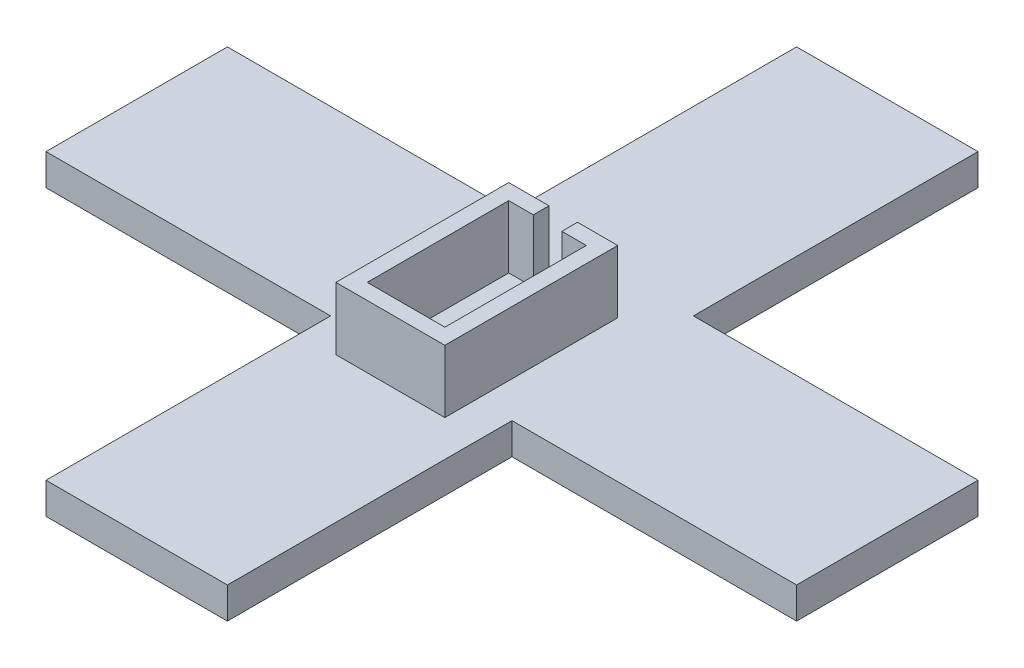
ISO-10303-21;
HEADER;
FILE_DESCRIPTION(('STEP AP214'),'2;1');
FILE_NAME('part.step','',(''),(''),'','','');
FILE_SCHEMA(('AUTOMOTIVE_DESIGN { 1 0 10303 214 1 1 1 1 }'));
ENDSEC;
DATA;
#1=APPLICATION_CONTEXT('core data for automotive mechanical design processes');
#2=APPLICATION_PROTOCOL_DEFINITION('international standard','automotive_design',2000,#1);
#3=PRODUCT_CONTEXT('',#1,'mechanical');
#4=PRODUCT('Part','Part','',(#3));
#5=PRODUCT_RELATED_PRODUCT_CATEGORY('part','',(#4));
#6=PRODUCT_DEFINITION_FORMATION('','',#4);
#7=PRODUCT_DEFINITION_CONTEXT('part definition',#1,'design');
#8=PRODUCT_DEFINITION('design','',#6,#7);
#9=PRODUCT_DEFINITION_SHAPE('','',#8);
#10=(LENGTH_UNIT() NAMED_UNIT(*) SI_UNIT(.MILLI.,.METRE.));
#11=(NAMED_UNIT(*) PLANE_ANGLE_UNIT() SI_UNIT($,.RADIAN.));
#12=(NAMED_UNIT(*) SI_UNIT($,.STERADIAN.) SOLID_ANGLE_UNIT());
#13=UNCERTAINTY_MEASURE_WITH_UNIT(LENGTH_MEASURE(1.E-05),#10,'distance_accuracy_value','');
#14=(GEOMETRIC_REPRESENTATION_CONTEXT(3) GLOBAL_UNCERTAINTY_ASSIGNED_CONTEXT((#13)) GLOBAL_UNIT_ASSIGNED_CONTEXT((#10,
#11,#12)) REPRESENTATION_CONTEXT('',''));
#15=CARTESIAN_POINT('',(0.,0.,0.));
#16=DIRECTION('',(0.,0.,1.));
#17=DIRECTION('',(1.,0.,0.));
#18=AXIS2_PLACEMENT_3D('',#15,#16,#17);
#19=CARTESIAN_POINT('',(0.,5.,0.));
#20=DIRECTION('',(0.,1.,0.));
#21=DIRECTION('',(0.,0.,1.));
#22=AXIS2_PLACEMENT_3D('',#19,#20,#21);
#23=PLANE('',#22);
#24=DIRECTION('',(-1.,0.,0.));
#25=VECTOR('',#24,1.);
#26=CARTESIAN_POINT('',(14.48,5.,-59.92));
#27=LINE('',#26,#25);
#28=CARTESIAN_POINT('',(14.48,5.,-59.92));
#29=VERTEX_POINT('',#28);
#30=CARTESIAN_POINT('',(-14.48,5.,-59.92));
#31=VERTEX_POINT('',#30);
#32=EDGE_CURVE('E112',#29,#31,#27,.T.);
#33=ORIENTED_EDGE('',*,*,#32,.T.);
#34=DIRECTION('',(0.,0.,1.));
#35=VECTOR('',#34,1.);
#36=CARTESIAN_POINT('',(-14.48,5.,-59.92));
#37=LINE('',#36,#35);
#38=CARTESIAN_POINT('',(-14.48,5.,-14.48));
#39=VERTEX_POINT('',#38);
#40=EDGE_CURVE('E262',#31,#39,#37,.T.);
#41=ORIENTED_EDGE('',*,*,#40,.T.);
#42=DIRECTION('',(-1.,0.,0.));
#43=VECTOR('',#42,1.);
#44=CARTESIAN_POINT('',(-14.48,5.,-14.48));
#45=LINE('',#44,#43);
#46=CARTESIAN_POINT('',(-59.92,5.,-14.48));
#47=VERTEX_POINT('',#46);
#48=EDGE_CURVE('E223',#39,#47,#45,.T.);
#49=ORIENTED_EDGE('',*,*,#48,.T.);
#50=DIRECTION('',(0.,0.,1.));
#51=VECTOR('',#50,1.);
#52=CARTESIAN_POINT('',(-59.92,5.,0.));
#53=LINE('',#52,#51);
#54=CARTESIAN_POINT('',(-59.92,5.,14.48));
#55=VERTEX_POINT('',#54);
#56=EDGE_CURVE('E240',#47,#55,#53,.T.);
#57=ORIENTED_EDGE('',*,*,#56,.T.);
#58=DIRECTION('',(1.,0.,0.));
#59=VECTOR('',#58,1.);
#60=CARTESIAN_POINT('',(-59.92,5.,14.48));
#61=LINE('',#60,#59);
#62=CARTESIAN_POINT('',(-14.48,5.,14.48));
#63=VERTEX_POINT('',#62);
#64=EDGE_CURVE('E237',#55,#63,#61,.T.);
#65=ORIENTED_EDGE('',*,*,#64,.T.);
#66=DIRECTION('',(0.,0.,1.));
#67=VECTOR('',#66,1.);
#68=CARTESIAN_POINT('',(-14.48,5.,14.48));
#69=LINE('',#68,#67);
#70=CARTESIAN_POINT('',(-14.48,5.,59.92));
#71=VERTEX_POINT('',#70);
#72=EDGE_CURVE('E239',#63,#71,#69,.T.);
#73=ORIENTED_EDGE('',*,*,#72,.T.);
#74=DIRECTION('',(1.,0.,0.));
#75=VECTOR('',#74,1.);
#76=CARTESIAN_POINT('',(-14.48,5.,59.92));
#77=LINE('',#76,#75);
#78=CARTESIAN_POINT('',(14.48,5.,59.92));
#79=VERTEX_POINT('',#78);
#80=EDGE_CURVE('E242',#71,#79,#77,.T.);
#81=ORIENTED_EDGE('',*,*,#80,.T.);
#82=DIRECTION('',(0.,0.,-1.));
#83=VECTOR('',#82,1.);
#84=CARTESIAN_POINT('',(14.48,5.,59.92));
#85=LINE('',#84,#83);
#86=CARTESIAN_POINT('',(14.48,5.,14.48));
#87=VERTEX_POINT('',#86);
#88=EDGE_CURVE('E248',#79,#87,#85,.T.);
#89=ORIENTED_EDGE('',*,*,#88,.T.);
#90=DIRECTION('',(1.,0.,0.));
#91=VECTOR('',#90,1.);
#92=CARTESIAN_POINT('',(14.48,5.,14.48));
#93=LINE('',#92,#91);
#94=CARTESIAN_POINT('',(59.92,5.,14.48));
#95=VERTEX_POINT('',#94);
#96=EDGE_CURVE('E148',#87,#95,#93,.T.);
#97=ORIENTED_EDGE('',*,*,#96,.T.);
#98=DIRECTION('',(0.,0.,-1.));
#99=VECTOR('',#98,1.);
#100=CARTESIAN_POINT('',(59.92,5.,0.));
#101=LINE('',#100,#99);
#102=CARTESIAN_POINT('',(59.92,5.,-14.48));
#103=VERTEX_POINT('',#102);
#104=EDGE_CURVE('E141',#95,#103,#101,.T.);
#105=ORIENTED_EDGE('',*,*,#104,.T.);
#106=DIRECTION('',(-1.,0.,0.));
#107=VECTOR('',#106,1.);
#108=CARTESIAN_POINT('',(59.92,5.,-14.48));
#109=LINE('',#108,#107);
#110=CARTESIAN_POINT('',(14.48,5.,-14.48));
#111=VERTEX_POINT('',#110);
#112=EDGE_CURVE('E145',#103,#111,#109,.T.);
#113=ORIENTED_EDGE('',*,*,#112,.T.);
#114=DIRECTION('',(0.,0.,-1.));
#115=VECTOR('',#114,1.);
#116=CARTESIAN_POINT('',(14.48,5.,-14.48));
#117=LINE('',#116,#115);
#118=EDGE_CURVE('E61',#111,#29,#117,.T.);
#119=ORIENTED_EDGE('',*,*,#118,.T.);
#120=EDGE_LOOP('',(#33,#41,#49,#57,#65,#73,#81,#89,#97,#105,#113,#119));
#121=FACE_BOUND('',#120,.T.);
#122=DIRECTION('',(-1.,0.,0.));
#123=VECTOR('',#122,1.);
#124=CARTESIAN_POINT('',(2.28,5.,-8.17999999999999));
#125=LINE('',#124,#123);
#126=CARTESIAN_POINT('',(8.7,5.,-8.17999999999999));
#127=VERTEX_POINT('',#126);
#128=CARTESIAN_POINT('',(2.28,5.,-8.17999999999999));
#129=VERTEX_POINT('',#128);
#130=EDGE_CURVE('E609',#127,#129,#125,.T.);
#131=ORIENTED_EDGE('',*,*,#130,.F.);
#132=DIRECTION('',(0.,0.,-1.));
#133=VECTOR('',#132,1.);
#134=CARTESIAN_POINT('',(8.7,5.,-8.17999999999999));
#135=LINE('',#134,#133);
#136=CARTESIAN_POINT('',(8.7,5.,19.42));
#137=VERTEX_POINT('',#136);
#138=EDGE_CURVE('E546',#137,#127,#135,.T.);
#139=ORIENTED_EDGE('',*,*,#138,.F.);
#140=DIRECTION('',(1.,0.,0.));
#141=VECTOR('',#140,1.);
#142=CARTESIAN_POINT('',(-8.7,5.,19.42));
#143=LINE('',#142,#141);
#144=CARTESIAN_POINT('',(-8.7,5.,19.42));
#145=VERTEX_POINT('',#144);
#146=EDGE_CURVE('E540',#145,#137,#143,.T.);
#147=ORIENTED_EDGE('',*,*,#146,.F.);
#148=DIRECTION('',(0.,0.,1.));
#149=VECTOR('',#148,1.);
#150=CARTESIAN_POINT('',(-8.7,5.,-8.17999999999999));
#151=LINE('',#150,#149);
#152=CARTESIAN_POINT('',(-8.7,5.,-8.17999999999999));
#153=VERTEX_POINT('',#152);
#154=EDGE_CURVE('E584',#153,#145,#151,.T.);
#155=ORIENTED_EDGE('',*,*,#154,.F.);
#156=DIRECTION('',(-1.,0.,0.));
#157=VECTOR('',#156,1.);
#158=CARTESIAN_POINT('',(-8.7,5.,-8.17999999999999));
#159=LINE('',#158,#157);
#160=CARTESIAN_POINT('',(-2.28,5.,-8.17999999999999));
#161=VERTEX_POINT('',#160);
#162=EDGE_CURVE('E586',#161,#153,#159,.T.);
#163=ORIENTED_EDGE('',*,*,#162,.F.);
#164=DIRECTION('',(0.,0.,-1.));
#165=VECTOR('',#164,1.);
#166=CARTESIAN_POINT('',(-2.28,5.,-8.17999999999999));
#167=LINE('',#166,#165);
#168=CARTESIAN_POINT('',(-2.28,5.,-5.67999999999999));
#169=VERTEX_POINT('',#168);
#170=EDGE_CURVE('E589',#169,#161,#167,.T.);
#171=ORIENTED_EDGE('',*,*,#170,.F.);
#172=DIRECTION('',(1.,0.,0.));
#173=VECTOR('',#172,1.);
#174=CARTESIAN_POINT('',(-2.28,5.,-5.67999999999999));
#175=LINE('',#174,#173);
#176=CARTESIAN_POINT('',(-6.2,5.,-5.67999999999998));
#177=VERTEX_POINT('',#176);
#178=EDGE_CURVE('E592',#177,#169,#175,.T.);
#179=ORIENTED_EDGE('',*,*,#178,.F.);
#180=DIRECTION('',(0.,0.,-1.));
#181=VECTOR('',#180,1.);
#182=CARTESIAN_POINT('',(-6.2,5.,-5.67999999999998));
#183=LINE('',#182,#181);
#184=CARTESIAN_POINT('',(-6.2,5.,16.92));
#185=VERTEX_POINT('',#184);
#186=EDGE_CURVE('E595',#185,#177,#183,.T.);
#187=ORIENTED_EDGE('',*,*,#186,.F.);
#188=DIRECTION('',(-1.,0.,0.));
#189=VECTOR('',#188,1.);
#190=CARTESIAN_POINT('',(-6.2,5.,16.92));
#191=LINE('',#190,#189);
#192=CARTESIAN_POINT('',(6.2,5.,16.92));
#193=VERTEX_POINT('',#192);
#194=EDGE_CURVE('E598',#193,#185,#191,.T.);
#195=ORIENTED_EDGE('',*,*,#194,.F.);
#196=DIRECTION('',(0.,0.,1.));
#197=VECTOR('',#196,1.);
#198=CARTESIAN_POINT('',(6.2,5.,16.92));
#199=LINE('',#198,#197);
#200=CARTESIAN_POINT('',(6.2,5.,-5.67999999999999));
#201=VERTEX_POINT('',#200);
#202=EDGE_CURVE('E601',#201,#193,#199,.T.);
#203=ORIENTED_EDGE('',*,*,#202,.F.);
#204=DIRECTION('',(1.,0.,0.));
#205=VECTOR('',#204,1.);
#206=CARTESIAN_POINT('',(6.2,5.,-5.67999999999999));
#207=LINE('',#206,#205);
#208=CARTESIAN_POINT('',(2.28,5.,-5.67999999999999));
#209=VERTEX_POINT('',#208);
#210=EDGE_CURVE('E604',#209,#201,#207,.T.);
#211=ORIENTED_EDGE('',*,*,#210,.F.);
#212=DIRECTION('',(0.,0.,1.));
#213=VECTOR('',#212,1.);
#214=CARTESIAN_POINT('',(2.28,5.,-5.67999999999999));
#215=LINE('',#214,#213);
#216=EDGE_CURVE('E607',#129,#209,#215,.T.);
#217=ORIENTED_EDGE('',*,*,#216,.F.);
#218=EDGE_LOOP('',(#131,#139,#147,#155,#163,#171,#179,#187,#195,#203,#211,#217));
#219=FACE_BOUND('',#218,.T.);
#220=ADVANCED_FACE('F37',(#121,#219),#23,.T.);
#221=CARTESIAN_POINT('',(0.,5.,-59.92));
#222=DIRECTION('',(0.,0.,1.));
#223=DIRECTION('',(1.,0.,0.));
#224=AXIS2_PLACEMENT_3D('',#221,#222,#223);
#225=PLANE('',#224);
#226=DIRECTION('',(-1.,0.,0.));
#227=VECTOR('',#226,1.);
#228=CARTESIAN_POINT('',(0.,0.,-59.92));
#229=LINE('',#228,#227);
#230=CARTESIAN_POINT('',(14.48,0.,-59.92));
#231=VERTEX_POINT('',#230);
#232=CARTESIAN_POINT('',(-14.48,0.,-59.92));
#233=VERTEX_POINT('',#232);
#234=EDGE_CURVE('E106',#231,#233,#229,.T.);
#235=ORIENTED_EDGE('',*,*,#234,.T.);
#236=DIRECTION('',(0.,-1.,0.));
#237=VECTOR('',#236,1.);
#238=CARTESIAN_POINT('',(-14.48,5.,-59.92));
#239=LINE('',#238,#237);
#240=EDGE_CURVE('E11',#31,#233,#239,.T.);
#241=ORIENTED_EDGE('',*,*,#240,.F.);
#242=ORIENTED_EDGE('',*,*,#32,.F.);
#243=DIRECTION('',(0.,-1.,0.));
#244=VECTOR('',#243,1.);
#245=CARTESIAN_POINT('',(14.48,5.,-59.92));
#246=LINE('',#245,#244);
#247=EDGE_CURVE('E165',#29,#231,#246,.T.);
#248=ORIENTED_EDGE('',*,*,#247,.T.);
#249=EDGE_LOOP('',(#235,#241,#242,#248));
#250=FACE_BOUND('',#249,.T.);
#251=ADVANCED_FACE('F39',(#250),#225,.F.);
#252=CARTESIAN_POINT('',(-14.48,5.,-59.92));
#253=DIRECTION('',(1.,0.,0.));
#254=DIRECTION('',(0.,0.,-1.));
#255=AXIS2_PLACEMENT_3D('',#252,#253,#254);
#256=PLANE('',#255);
#257=DIRECTION('',(0.,0.,1.));
#258=VECTOR('',#257,1.);
#259=CARTESIAN_POINT('',(-14.48,0.,-59.92));
#260=LINE('',#259,#258);
#261=CARTESIAN_POINT('',(-14.48,0.,-14.48));
#262=VERTEX_POINT('',#261);
#263=EDGE_CURVE('E170',#233,#262,#260,.T.);
#264=ORIENTED_EDGE('',*,*,#263,.T.);
#265=DIRECTION('',(0.,-1.,0.));
#266=VECTOR('',#265,1.);
#267=CARTESIAN_POINT('',(-14.48,5.,-14.48));
#268=LINE('',#267,#266);
#269=EDGE_CURVE('E45',#39,#262,#268,.T.);
#270=ORIENTED_EDGE('',*,*,#269,.F.);
#271=ORIENTED_EDGE('',*,*,#40,.F.);
#272=ORIENTED_EDGE('',*,*,#240,.T.);
#273=EDGE_LOOP('',(#264,#270,#271,#272));
#274=FACE_BOUND('',#273,.T.);
#275=ADVANCED_FACE('F267',(#274),#256,.F.);
#276=CARTESIAN_POINT('',(-14.48,5.,-14.48));
#277=DIRECTION('',(0.,0.,1.));
#278=DIRECTION('',(1.,0.,0.));
#279=AXIS2_PLACEMENT_3D('',#276,#277,#278);
#280=PLANE('',#279);
#281=DIRECTION('',(-1.,0.,0.));
#282=VECTOR('',#281,1.);
#283=CARTESIAN_POINT('',(-14.48,0.,-14.48));
#284=LINE('',#283,#282);
#285=CARTESIAN_POINT('',(-59.92,0.,-14.48));
#286=VERTEX_POINT('',#285);
#287=EDGE_CURVE('E173',#262,#286,#284,.T.);
#288=ORIENTED_EDGE('',*,*,#287,.T.);
#289=DIRECTION('',(0.,-1.,0.));
#290=VECTOR('',#289,1.);
#291=CARTESIAN_POINT('',(-59.92,5.,-14.48));
#292=LINE('',#291,#290);
#293=EDGE_CURVE('E214',#47,#286,#292,.T.);
#294=ORIENTED_EDGE('',*,*,#293,.F.);
#295=ORIENTED_EDGE('',*,*,#48,.F.);
#296=ORIENTED_EDGE('',*,*,#269,.T.);
#297=EDGE_LOOP('',(#288,#294,#295,#296));
#298=FACE_BOUND('',#297,.T.);
#299=ADVANCED_FACE('F221',(#298),#280,.F.);
#300=CARTESIAN_POINT('',(-59.92,5.,14.48));
#301=DIRECTION('',(1.,0.,0.));
#302=DIRECTION('',(0.,0.,-1.));
#303=AXIS2_PLACEMENT_3D('',#300,#301,#302);
#304=PLANE('',#303);
#305=DIRECTION('',(0.,0.,1.));
#306=VECTOR('',#305,1.);
#307=CARTESIAN_POINT('',(-59.92,0.,14.48));
#308=LINE('',#307,#306);
#309=CARTESIAN_POINT('',(-59.92,0.,14.48));
#310=VERTEX_POINT('',#309);
#311=EDGE_CURVE('E176',#286,#310,#308,.T.);
#312=ORIENTED_EDGE('',*,*,#311,.T.);
#313=DIRECTION('',(0.,-1.,0.));
#314=VECTOR('',#313,1.);
#315=CARTESIAN_POINT('',(-59.92,5.,14.48));
#316=LINE('',#315,#314);
#317=EDGE_CURVE('E211',#55,#310,#316,.T.);
#318=ORIENTED_EDGE('',*,*,#317,.F.);
#319=ORIENTED_EDGE('',*,*,#56,.F.);
#320=ORIENTED_EDGE('',*,*,#293,.T.);
#321=EDGE_LOOP('',(#312,#318,#319,#320));
#322=FACE_BOUND('',#321,.T.);
#323=ADVANCED_FACE('F231',(#322),#304,.F.);
#324=CARTESIAN_POINT('',(-59.92,5.,14.48));
#325=DIRECTION('',(0.,0.,-1.));
#326=DIRECTION('',(-1.,0.,0.));
#327=AXIS2_PLACEMENT_3D('',#324,#325,#326);
#328=PLANE('',#327);
#329=DIRECTION('',(1.,0.,0.));
#330=VECTOR('',#329,1.);
#331=CARTESIAN_POINT('',(-59.92,0.,14.48));
#332=LINE('',#331,#330);
#333=CARTESIAN_POINT('',(-14.48,0.,14.48));
#334=VERTEX_POINT('',#333);
#335=EDGE_CURVE('E178',#310,#334,#332,.T.);
#336=ORIENTED_EDGE('',*,*,#335,.T.);
#337=DIRECTION('',(0.,-1.,0.));
#338=VECTOR('',#337,1.);
#339=CARTESIAN_POINT('',(-14.48,5.,14.48));
#340=LINE('',#339,#338);
#341=EDGE_CURVE('E208',#63,#334,#340,.T.);
#342=ORIENTED_EDGE('',*,*,#341,.F.);
#343=ORIENTED_EDGE('',*,*,#64,.F.);
#344=ORIENTED_EDGE('',*,*,#317,.T.);
#345=EDGE_LOOP('',(#336,#342,#343,#344));
#346=FACE_BOUND('',#345,.T.);
#347=ADVANCED_FACE('F235',(#346),#328,.F.);
#348=CARTESIAN_POINT('',(-14.48,5.,14.48));
#349=DIRECTION('',(1.,0.,0.));
#350=DIRECTION('',(0.,0.,-1.));
#351=AXIS2_PLACEMENT_3D('',#348,#349,#350);
#352=PLANE('',#351);
#353=DIRECTION('',(0.,0.,1.));
#354=VECTOR('',#353,1.);
#355=CARTESIAN_POINT('',(-14.48,0.,14.48));
#356=LINE('',#355,#354);
#357=CARTESIAN_POINT('',(-14.48,0.,59.92));
#358=VERTEX_POINT('',#357);
#359=EDGE_CURVE('E180',#334,#358,#356,.T.);
#360=ORIENTED_EDGE('',*,*,#359,.T.);
#361=DIRECTION('',(0.,-1.,0.));
#362=VECTOR('',#361,1.);
#363=CARTESIAN_POINT('',(-14.48,5.,59.92));
#364=LINE('',#363,#362);
#365=EDGE_CURVE('E205',#71,#358,#364,.T.);
#366=ORIENTED_EDGE('',*,*,#365,.F.);
#367=ORIENTED_EDGE('',*,*,#72,.F.);
#368=ORIENTED_EDGE('',*,*,#341,.T.);
#369=EDGE_LOOP('',(#360,#366,#367,#368));
#370=FACE_BOUND('',#369,.T.);
#371=ADVANCED_FACE('F297',(#370),#352,.F.);
#372=CARTESIAN_POINT('',(0.,5.,59.92));
#373=DIRECTION('',(0.,0.,-1.));
#374=DIRECTION('',(-1.,0.,0.));
#375=AXIS2_PLACEMENT_3D('',#372,#373,#374);
#376=PLANE('',#375);
#377=DIRECTION('',(1.,0.,0.));
#378=VECTOR('',#377,1.);
#379=CARTESIAN_POINT('',(0.,0.,59.92));
#380=LINE('',#379,#378);
#381=CARTESIAN_POINT('',(14.48,0.,59.92));
#382=VERTEX_POINT('',#381);
#383=EDGE_CURVE('E183',#358,#382,#380,.T.);
#384=ORIENTED_EDGE('',*,*,#383,.T.);
#385=DIRECTION('',(0.,-1.,0.));
#386=VECTOR('',#385,1.);
#387=CARTESIAN_POINT('',(14.48,5.,59.92));
#388=LINE('',#387,#386);
#389=EDGE_CURVE('E202',#79,#382,#388,.T.);
#390=ORIENTED_EDGE('',*,*,#389,.F.);
#391=ORIENTED_EDGE('',*,*,#80,.F.);
#392=ORIENTED_EDGE('',*,*,#365,.T.);
#393=EDGE_LOOP('',(#384,#390,#391,#392));
#394=FACE_BOUND('',#393,.T.);
#395=ADVANCED_FACE('F294',(#394),#376,.F.);
#396=CARTESIAN_POINT('',(14.48,5.,59.92));
#397=DIRECTION('',(-1.,0.,0.));
#398=DIRECTION('',(0.,0.,1.));
#399=AXIS2_PLACEMENT_3D('',#396,#397,#398);
#400=PLANE('',#399);
#401=DIRECTION('',(0.,0.,-1.));
#402=VECTOR('',#401,1.);
#403=CARTESIAN_POINT('',(14.48,0.,59.92));
#404=LINE('',#403,#402);
#405=CARTESIAN_POINT('',(14.48,0.,14.48));
#406=VERTEX_POINT('',#405);
#407=EDGE_CURVE('E185',#382,#406,#404,.T.);
#408=ORIENTED_EDGE('',*,*,#407,.T.);
#409=DIRECTION('',(0.,-1.,0.));
#410=VECTOR('',#409,1.);
#411=CARTESIAN_POINT('',(14.48,5.,14.48));
#412=LINE('',#411,#410);
#413=EDGE_CURVE('E199',#87,#406,#412,.T.);
#414=ORIENTED_EDGE('',*,*,#413,.F.);
#415=ORIENTED_EDGE('',*,*,#88,.F.);
#416=ORIENTED_EDGE('',*,*,#389,.T.);
#417=EDGE_LOOP('',(#408,#414,#415,#416));
#418=FACE_BOUND('',#417,.T.);
#419=ADVANCED_FACE('F254',(#418),#400,.F.);
#420=CARTESIAN_POINT('',(14.48,5.,14.48));
#421=DIRECTION('',(0.,0.,-1.));
#422=DIRECTION('',(-1.,0.,0.));
#423=AXIS2_PLACEMENT_3D('',#420,#421,#422);
#424=PLANE('',#423);
#425=DIRECTION('',(1.,0.,0.));
#426=VECTOR('',#425,1.);
#427=CARTESIAN_POINT('',(14.48,0.,14.48));
#428=LINE('',#427,#426);
#429=CARTESIAN_POINT('',(59.92,0.,14.48));
#430=VERTEX_POINT('',#429);
#431=EDGE_CURVE('E187',#406,#430,#428,.T.);
#432=ORIENTED_EDGE('',*,*,#431,.T.);
#433=DIRECTION('',(0.,-1.,0.));
#434=VECTOR('',#433,1.);
#435=CARTESIAN_POINT('',(59.92,5.,14.48));
#436=LINE('',#435,#434);
#437=EDGE_CURVE('E159',#95,#430,#436,.T.);
#438=ORIENTED_EDGE('',*,*,#437,.F.);
#439=ORIENTED_EDGE('',*,*,#96,.F.);
#440=ORIENTED_EDGE('',*,*,#413,.T.);
#441=EDGE_LOOP('',(#432,#438,#439,#440));
#442=FACE_BOUND('',#441,.T.);
#443=ADVANCED_FACE('F258',(#442),#424,.F.);
#444=CARTESIAN_POINT('',(59.92,5.,0.));
#445=DIRECTION('',(-1.,0.,0.));
#446=DIRECTION('',(0.,0.,1.));
#447=AXIS2_PLACEMENT_3D('',#444,#445,#446);
#448=PLANE('',#447);
#449=DIRECTION('',(0.,0.,-1.));
#450=VECTOR('',#449,1.);
#451=CARTESIAN_POINT('',(59.92,0.,0.));
#452=LINE('',#451,#450);
#453=CARTESIAN_POINT('',(59.92,0.,-14.48));
#454=VERTEX_POINT('',#453);
#455=EDGE_CURVE('E156',#430,#454,#452,.T.);
#456=ORIENTED_EDGE('',*,*,#455,.T.);
#457=DIRECTION('',(0.,-1.,0.));
#458=VECTOR('',#457,1.);
#459=CARTESIAN_POINT('',(59.92,5.,-14.48));
#460=LINE('',#459,#458);
#461=EDGE_CURVE('E154',#103,#454,#460,.T.);
#462=ORIENTED_EDGE('',*,*,#461,.F.);
#463=ORIENTED_EDGE('',*,*,#104,.F.);
#464=ORIENTED_EDGE('',*,*,#437,.T.);
#465=EDGE_LOOP('',(#456,#462,#463,#464));
#466=FACE_BOUND('',#465,.T.);
#467=ADVANCED_FACE('F155',(#466),#448,.F.);
#468=CARTESIAN_POINT('',(59.92,5.,-14.48));
#469=DIRECTION('',(0.,0.,1.));
#470=DIRECTION('',(1.,0.,0.));
#471=AXIS2_PLACEMENT_3D('',#468,#469,#470);
#472=PLANE('',#471);
#473=DIRECTION('',(-1.,0.,0.));
#474=VECTOR('',#473,1.);
#475=CARTESIAN_POINT('',(59.92,0.,-14.48));
#476=LINE('',#475,#474);
#477=CARTESIAN_POINT('',(14.48,0.,-14.48));
#478=VERTEX_POINT('',#477);
#479=EDGE_CURVE('E191',#454,#478,#476,.T.);
#480=ORIENTED_EDGE('',*,*,#479,.T.);
#481=DIRECTION('',(0.,-1.,0.));
#482=VECTOR('',#481,1.);
#483=CARTESIAN_POINT('',(14.48,5.,-14.48));
#484=LINE('',#483,#482);
#485=EDGE_CURVE('E160',#111,#478,#484,.T.);
#486=ORIENTED_EDGE('',*,*,#485,.F.);
#487=ORIENTED_EDGE('',*,*,#112,.F.);
#488=ORIENTED_EDGE('',*,*,#461,.T.);
#489=EDGE_LOOP('',(#480,#486,#487,#488));
#490=FACE_BOUND('',#489,.T.);
#491=ADVANCED_FACE('F162',(#490),#472,.F.);
#492=CARTESIAN_POINT('',(14.48,5.,-14.48));
#493=DIRECTION('',(-1.,0.,0.));
#494=DIRECTION('',(0.,0.,1.));
#495=AXIS2_PLACEMENT_3D('',#492,#493,#494);
#496=PLANE('',#495);
#497=DIRECTION('',(0.,0.,-1.));
#498=VECTOR('',#497,1.);
#499=CARTESIAN_POINT('',(14.48,0.,-14.48));
#500=LINE('',#499,#498);
#501=EDGE_CURVE('E193',#478,#231,#500,.T.);
#502=ORIENTED_EDGE('',*,*,#501,.T.);
#503=ORIENTED_EDGE('',*,*,#247,.F.);
#504=ORIENTED_EDGE('',*,*,#118,.F.);
#505=ORIENTED_EDGE('',*,*,#485,.T.);
#506=EDGE_LOOP('',(#502,#503,#504,#505));
#507=FACE_BOUND('',#506,.T.);
#508=ADVANCED_FACE('F260',(#507),#496,.F.);
#509=CARTESIAN_POINT('',(0.,0.,0.));
#510=DIRECTION('',(0.,1.,0.));
#511=DIRECTION('',(0.,0.,1.));
#512=AXIS2_PLACEMENT_3D('',#509,#510,#511);
#513=PLANE('',#512);
#514=ORIENTED_EDGE('',*,*,#234,.F.);
#515=ORIENTED_EDGE('',*,*,#501,.F.);
#516=ORIENTED_EDGE('',*,*,#479,.F.);
#517=ORIENTED_EDGE('',*,*,#455,.F.);
#518=ORIENTED_EDGE('',*,*,#431,.F.);
#519=ORIENTED_EDGE('',*,*,#407,.F.);
#520=ORIENTED_EDGE('',*,*,#383,.F.);
#521=ORIENTED_EDGE('',*,*,#359,.F.);
#522=ORIENTED_EDGE('',*,*,#335,.F.);
#523=ORIENTED_EDGE('',*,*,#311,.F.);
#524=ORIENTED_EDGE('',*,*,#287,.F.);
#525=ORIENTED_EDGE('',*,*,#263,.F.);
#526=EDGE_LOOP('',(#514,#515,#516,#517,#518,#519,#520,#521,#522,#523,#524,#525));
#527=FACE_BOUND('',#526,.T.);
#528=ADVANCED_FACE('F226',(#527),#513,.F.);
#529=CARTESIAN_POINT('',(8.7,15.,-8.17999999999999));
#530=DIRECTION('',(-1.,0.,0.));
#531=DIRECTION('',(0.,0.,1.));
#532=AXIS2_PLACEMENT_3D('',#529,#530,#531);
#533=PLANE('',#532);
#534=ORIENTED_EDGE('',*,*,#138,.T.);
#535=DIRECTION('',(0.,-1.,0.));
#536=VECTOR('',#535,1.);
#537=CARTESIAN_POINT('',(8.7,15.,-8.17999999999999));
#538=LINE('',#537,#536);
#539=CARTESIAN_POINT('',(8.7,15.,-8.17999999999999));
#540=VERTEX_POINT('',#539);
#541=EDGE_CURVE('E171',#540,#127,#538,.T.);
#542=ORIENTED_EDGE('',*,*,#541,.F.);
#543=DIRECTION('',(0.,0.,-1.));
#544=VECTOR('',#543,1.);
#545=CARTESIAN_POINT('',(8.7,15.,-8.17999999999999));
#546=LINE('',#545,#544);
#547=CARTESIAN_POINT('',(8.7,15.,19.42));
#548=VERTEX_POINT('',#547);
#549=EDGE_CURVE('E528',#548,#540,#546,.T.);
#550=ORIENTED_EDGE('',*,*,#549,.F.);
#551=DIRECTION('',(0.,-1.,0.));
#552=VECTOR('',#551,1.);
#553=CARTESIAN_POINT('',(8.7,15.,19.42));
#554=LINE('',#553,#552);
#555=EDGE_CURVE('E581',#548,#137,#554,.T.);
#556=ORIENTED_EDGE('',*,*,#555,.T.);
#557=EDGE_LOOP('',(#534,#542,#550,#556));
#558=FACE_BOUND('',#557,.T.);
#559=ADVANCED_FACE('F280',(#558),#533,.F.);
#560=CARTESIAN_POINT('',(2.28,15.,-8.17999999999999));
#561=DIRECTION('',(0.,0.,1.));
#562=DIRECTION('',(1.,0.,0.));
#563=AXIS2_PLACEMENT_3D('',#560,#561,#562);
#564=PLANE('',#563);
#565=ORIENTED_EDGE('',*,*,#130,.T.);
#566=DIRECTION('',(0.,-1.,0.));
#567=VECTOR('',#566,1.);
#568=CARTESIAN_POINT('',(2.28,15.,-8.17999999999999));
#569=LINE('',#568,#567);
#570=CARTESIAN_POINT('',(2.28,15.,-8.17999999999999));
#571=VERTEX_POINT('',#570);
#572=EDGE_CURVE('E549',#571,#129,#569,.T.);
#573=ORIENTED_EDGE('',*,*,#572,.F.);
#574=DIRECTION('',(-1.,0.,0.));
#575=VECTOR('',#574,1.);
#576=CARTESIAN_POINT('',(2.28,15.,-8.17999999999999));
#577=LINE('',#576,#575);
#578=EDGE_CURVE('E533',#540,#571,#577,.T.);
#579=ORIENTED_EDGE('',*,*,#578,.F.);
#580=ORIENTED_EDGE('',*,*,#541,.T.);
#581=EDGE_LOOP('',(#565,#573,#579,#580));
#582=FACE_BOUND('',#581,.T.);
#583=ADVANCED_FACE('F351',(#582),#564,.F.);
#584=CARTESIAN_POINT('',(2.28,15.,-5.67999999999999));
#585=DIRECTION('',(1.,0.,0.));
#586=DIRECTION('',(0.,0.,-1.));
#587=AXIS2_PLACEMENT_3D('',#584,#585,#586);
#588=PLANE('',#587);
#589=ORIENTED_EDGE('',*,*,#216,.T.);
#590=DIRECTION('',(0.,-1.,0.));
#591=VECTOR('',#590,1.);
#592=CARTESIAN_POINT('',(2.28,15.,-5.67999999999999));
#593=LINE('',#592,#591);
#594=CARTESIAN_POINT('',(2.28,15.,-5.67999999999999));
#595=VERTEX_POINT('',#594);
#596=EDGE_CURVE('E551',#595,#209,#593,.T.);
#597=ORIENTED_EDGE('',*,*,#596,.F.);
#598=DIRECTION('',(0.,0.,1.));
#599=VECTOR('',#598,1.);
#600=CARTESIAN_POINT('',(2.28,15.,-5.67999999999999));
#601=LINE('',#600,#599);
#602=EDGE_CURVE('E636',#571,#595,#601,.T.);
#603=ORIENTED_EDGE('',*,*,#602,.F.);
#604=ORIENTED_EDGE('',*,*,#572,.T.);
#605=EDGE_LOOP('',(#589,#597,#603,#604));
#606=FACE_BOUND('',#605,.T.);
#607=ADVANCED_FACE('F358',(#606),#588,.F.);
#608=CARTESIAN_POINT('',(6.2,15.,-5.67999999999999));
#609=DIRECTION('',(0.,0.,-1.));
#610=DIRECTION('',(-1.,0.,0.));
#611=AXIS2_PLACEMENT_3D('',#608,#609,#610);
#612=PLANE('',#611);
#613=ORIENTED_EDGE('',*,*,#210,.T.);
#614=DIRECTION('',(0.,-1.,0.));
#615=VECTOR('',#614,1.);
#616=CARTESIAN_POINT('',(6.2,15.,-5.67999999999999));
#617=LINE('',#616,#615);
#618=CARTESIAN_POINT('',(6.2,15.,-5.67999999999999));
#619=VERTEX_POINT('',#618);
#620=EDGE_CURVE('E557',#619,#201,#617,.T.);
#621=ORIENTED_EDGE('',*,*,#620,.F.);
#622=DIRECTION('',(1.,0.,0.));
#623=VECTOR('',#622,1.);
#624=CARTESIAN_POINT('',(6.2,15.,-5.67999999999999));
#625=LINE('',#624,#623);
#626=EDGE_CURVE('E633',#595,#619,#625,.T.);
#627=ORIENTED_EDGE('',*,*,#626,.F.);
#628=ORIENTED_EDGE('',*,*,#596,.T.);
#629=EDGE_LOOP('',(#613,#621,#627,#628));
#630=FACE_BOUND('',#629,.T.);
#631=ADVANCED_FACE('F365',(#630),#612,.F.);
#632=CARTESIAN_POINT('',(6.2,15.,16.92));
#633=DIRECTION('',(1.,0.,0.));
#634=DIRECTION('',(0.,0.,-1.));
#635=AXIS2_PLACEMENT_3D('',#632,#633,#634);
#636=PLANE('',#635);
#637=ORIENTED_EDGE('',*,*,#202,.T.);
#638=DIRECTION('',(0.,-1.,0.));
#639=VECTOR('',#638,1.);
#640=CARTESIAN_POINT('',(6.2,15.,16.92));
#641=LINE('',#640,#639);
#642=CARTESIAN_POINT('',(6.2,15.,16.92));
#643=VERTEX_POINT('',#642);
#644=EDGE_CURVE('E562',#643,#193,#641,.T.);
#645=ORIENTED_EDGE('',*,*,#644,.F.);
#646=DIRECTION('',(0.,0.,1.));
#647=VECTOR('',#646,1.);
#648=CARTESIAN_POINT('',(6.2,15.,16.92));
#649=LINE('',#648,#647);
#650=EDGE_CURVE('E630',#619,#643,#649,.T.);
#651=ORIENTED_EDGE('',*,*,#650,.F.);
#652=ORIENTED_EDGE('',*,*,#620,.T.);
#653=EDGE_LOOP('',(#637,#645,#651,#652));
#654=FACE_BOUND('',#653,.T.);
#655=ADVANCED_FACE('F373',(#654),#636,.F.);
#656=CARTESIAN_POINT('',(-6.2,15.,16.92));
#657=DIRECTION('',(0.,0.,1.));
#658=DIRECTION('',(1.,0.,0.));
#659=AXIS2_PLACEMENT_3D('',#656,#657,#658);
#660=PLANE('',#659);
#661=ORIENTED_EDGE('',*,*,#194,.T.);
#662=DIRECTION('',(0.,-1.,0.));
#663=VECTOR('',#662,1.);
#664=CARTESIAN_POINT('',(-6.2,15.,16.92));
#665=LINE('',#664,#663);
#666=CARTESIAN_POINT('',(-6.2,15.,16.92));
#667=VERTEX_POINT('',#666);
#668=EDGE_CURVE('E565',#667,#185,#665,.T.);
#669=ORIENTED_EDGE('',*,*,#668,.F.);
#670=DIRECTION('',(-1.,0.,0.));
#671=VECTOR('',#670,1.);
#672=CARTESIAN_POINT('',(-6.2,15.,16.92));
#673=LINE('',#672,#671);
#674=EDGE_CURVE('E627',#643,#667,#673,.T.);
#675=ORIENTED_EDGE('',*,*,#674,.F.);
#676=ORIENTED_EDGE('',*,*,#644,.T.);
#677=EDGE_LOOP('',(#661,#669,#675,#676));
#678=FACE_BOUND('',#677,.T.);
#679=ADVANCED_FACE('F381',(#678),#660,.F.);
#680=CARTESIAN_POINT('',(-6.2,15.,-5.67999999999998));
#681=DIRECTION('',(-1.,0.,0.));
#682=DIRECTION('',(0.,0.,1.));
#683=AXIS2_PLACEMENT_3D('',#680,#681,#682);
#684=PLANE('',#683);
#685=ORIENTED_EDGE('',*,*,#186,.T.);
#686=DIRECTION('',(0.,-1.,0.));
#687=VECTOR('',#686,1.);
#688=CARTESIAN_POINT('',(-6.2,15.,-5.67999999999998));
#689=LINE('',#688,#687);
#690=CARTESIAN_POINT('',(-6.2,15.,-5.67999999999998));
#691=VERTEX_POINT('',#690);
#692=EDGE_CURVE('E568',#691,#177,#689,.T.);
#693=ORIENTED_EDGE('',*,*,#692,.F.);
#694=DIRECTION('',(0.,0.,-1.));
#695=VECTOR('',#694,1.);
#696=CARTESIAN_POINT('',(-6.2,15.,-5.67999999999998));
#697=LINE('',#696,#695);
#698=EDGE_CURVE('E624',#667,#691,#697,.T.);
#699=ORIENTED_EDGE('',*,*,#698,.F.);
#700=ORIENTED_EDGE('',*,*,#668,.T.);
#701=EDGE_LOOP('',(#685,#693,#699,#700));
#702=FACE_BOUND('',#701,.T.);
#703=ADVANCED_FACE('F389',(#702),#684,.F.);
#704=CARTESIAN_POINT('',(-2.28,15.,-5.67999999999999));
#705=DIRECTION('',(0.,0.,-1.));
#706=DIRECTION('',(-1.,0.,0.));
#707=AXIS2_PLACEMENT_3D('',#704,#705,#706);
#708=PLANE('',#707);
#709=ORIENTED_EDGE('',*,*,#178,.T.);
#710=DIRECTION('',(0.,-1.,0.));
#711=VECTOR('',#710,1.);
#712=CARTESIAN_POINT('',(-2.28,15.,-5.67999999999999));
#713=LINE('',#712,#711);
#714=CARTESIAN_POINT('',(-2.28,15.,-5.67999999999999));
#715=VERTEX_POINT('',#714);
#716=EDGE_CURVE('E571',#715,#169,#713,.T.);
#717=ORIENTED_EDGE('',*,*,#716,.F.);
#718=DIRECTION('',(1.,0.,0.));
#719=VECTOR('',#718,1.);
#720=CARTESIAN_POINT('',(-2.28,15.,-5.67999999999999));
#721=LINE('',#720,#719);
#722=EDGE_CURVE('E621',#691,#715,#721,.T.);
#723=ORIENTED_EDGE('',*,*,#722,.F.);
#724=ORIENTED_EDGE('',*,*,#692,.T.);
#725=EDGE_LOOP('',(#709,#717,#723,#724));
#726=FACE_BOUND('',#725,.T.);
#727=ADVANCED_FACE('F397',(#726),#708,.F.);
#728=CARTESIAN_POINT('',(-2.28,15.,-8.17999999999999));
#729=DIRECTION('',(-1.,0.,0.));
#730=DIRECTION('',(0.,0.,1.));
#731=AXIS2_PLACEMENT_3D('',#728,#729,#730);
#732=PLANE('',#731);
#733=ORIENTED_EDGE('',*,*,#170,.T.);
#734=DIRECTION('',(0.,-1.,0.));
#735=VECTOR('',#734,1.);
#736=CARTESIAN_POINT('',(-2.28,15.,-8.17999999999999));
#737=LINE('',#736,#735);
#738=CARTESIAN_POINT('',(-2.28,15.,-8.17999999999999));
#739=VERTEX_POINT('',#738);
#740=EDGE_CURVE('E574',#739,#161,#737,.T.);
#741=ORIENTED_EDGE('',*,*,#740,.F.);
#742=DIRECTION('',(0.,0.,-1.));
#743=VECTOR('',#742,1.);
#744=CARTESIAN_POINT('',(-2.28,15.,-8.17999999999999));
#745=LINE('',#744,#743);
#746=EDGE_CURVE('E618',#715,#739,#745,.T.);
#747=ORIENTED_EDGE('',*,*,#746,.F.);
#748=ORIENTED_EDGE('',*,*,#716,.T.);
#749=EDGE_LOOP('',(#733,#741,#747,#748));
#750=FACE_BOUND('',#749,.T.);
#751=ADVANCED_FACE('F405',(#750),#732,.F.);
#752=CARTESIAN_POINT('',(-8.7,15.,-8.17999999999999));
#753=DIRECTION('',(0.,0.,1.));
#754=DIRECTION('',(1.,0.,0.));
#755=AXIS2_PLACEMENT_3D('',#752,#753,#754);
#756=PLANE('',#755);
#757=ORIENTED_EDGE('',*,*,#162,.T.);
#758=DIRECTION('',(0.,-1.,0.));
#759=VECTOR('',#758,1.);
#760=CARTESIAN_POINT('',(-8.7,15.,-8.17999999999999));
#761=LINE('',#760,#759);
#762=CARTESIAN_POINT('',(-8.7,15.,-8.17999999999999));
#763=VERTEX_POINT('',#762);
#764=EDGE_CURVE('E577',#763,#153,#761,.T.);
#765=ORIENTED_EDGE('',*,*,#764,.F.);
#766=DIRECTION('',(-1.,0.,0.));
#767=VECTOR('',#766,1.);
#768=CARTESIAN_POINT('',(-8.7,15.,-8.17999999999999));
#769=LINE('',#768,#767);
#770=EDGE_CURVE('E615',#739,#763,#769,.T.);
#771=ORIENTED_EDGE('',*,*,#770,.F.);
#772=ORIENTED_EDGE('',*,*,#740,.T.);
#773=EDGE_LOOP('',(#757,#765,#771,#772));
#774=FACE_BOUND('',#773,.T.);
#775=ADVANCED_FACE('F413',(#774),#756,.F.);
#776=CARTESIAN_POINT('',(-8.7,15.,-8.17999999999999));
#777=DIRECTION('',(1.,0.,0.));
#778=DIRECTION('',(0.,0.,-1.));
#779=AXIS2_PLACEMENT_3D('',#776,#777,#778);
#780=PLANE('',#779);
#781=ORIENTED_EDGE('',*,*,#154,.T.);
#782=DIRECTION('',(0.,-1.,0.));
#783=VECTOR('',#782,1.);
#784=CARTESIAN_POINT('',(-8.7,15.,19.42));
#785=LINE('',#784,#783);
#786=CARTESIAN_POINT('',(-8.7,15.,19.42));
#787=VERTEX_POINT('',#786);
#788=EDGE_CURVE('E52',#787,#145,#785,.T.);
#789=ORIENTED_EDGE('',*,*,#788,.F.);
#790=DIRECTION('',(0.,0.,1.));
#791=VECTOR('',#790,1.);
#792=CARTESIAN_POINT('',(-8.7,15.,-8.17999999999999));
#793=LINE('',#792,#791);
#794=EDGE_CURVE('E613',#763,#787,#793,.T.);
#795=ORIENTED_EDGE('',*,*,#794,.F.);
#796=ORIENTED_EDGE('',*,*,#764,.T.);
#797=EDGE_LOOP('',(#781,#789,#795,#796));
#798=FACE_BOUND('',#797,.T.);
#799=ADVANCED_FACE('F421',(#798),#780,.F.);
#800=CARTESIAN_POINT('',(-8.7,15.,19.42));
#801=DIRECTION('',(0.,0.,-1.));
#802=DIRECTION('',(-1.,0.,0.));
#803=AXIS2_PLACEMENT_3D('',#800,#801,#802);
#804=PLANE('',#803);
#805=ORIENTED_EDGE('',*,*,#146,.T.);
#806=ORIENTED_EDGE('',*,*,#555,.F.);
#807=DIRECTION('',(1.,0.,0.));
#808=VECTOR('',#807,1.);
#809=CARTESIAN_POINT('',(-8.7,15.,19.42));
#810=LINE('',#809,#808);
#811=EDGE_CURVE('E536',#787,#548,#810,.T.);
#812=ORIENTED_EDGE('',*,*,#811,.F.);
#813=ORIENTED_EDGE('',*,*,#788,.T.);
#814=EDGE_LOOP('',(#805,#806,#812,#813));
#815=FACE_BOUND('',#814,.T.);
#816=ADVANCED_FACE('F429',(#815),#804,.F.);
#817=CARTESIAN_POINT('',(0.,15.,0.));
#818=DIRECTION('',(0.,1.,0.));
#819=DIRECTION('',(0.,0.,1.));
#820=AXIS2_PLACEMENT_3D('',#817,#818,#819);
#821=PLANE('',#820);
#822=ORIENTED_EDGE('',*,*,#549,.T.);
#823=ORIENTED_EDGE('',*,*,#578,.T.);
#824=ORIENTED_EDGE('',*,*,#602,.T.);
#825=ORIENTED_EDGE('',*,*,#626,.T.);
#826=ORIENTED_EDGE('',*,*,#650,.T.);
#827=ORIENTED_EDGE('',*,*,#674,.T.);
#828=ORIENTED_EDGE('',*,*,#698,.T.);
#829=ORIENTED_EDGE('',*,*,#722,.T.);
#830=ORIENTED_EDGE('',*,*,#746,.T.);
#831=ORIENTED_EDGE('',*,*,#770,.T.);
#832=ORIENTED_EDGE('',*,*,#794,.T.);
#833=ORIENTED_EDGE('',*,*,#811,.T.);
#834=EDGE_LOOP('',(#822,#823,#824,#825,#826,#827,#828,#829,#830,#831,#832,#833));
#835=FACE_BOUND('',#834,.T.);
#836=ADVANCED_FACE('F437',(#835),#821,.T.);
#837=CLOSED_SHELL('',(#220,#251,#275,#299,#323,#347,#371,#395,#419,#443,#467,#491,#508,#528,
#559,#583,#607,#631,#655,#679,#703,#727,#751,#775,#799,#816,#836));
#838=MANIFOLD_SOLID_BREP('B2',#837);
#839=ADVANCED_BREP_SHAPE_REPRESENTATION('',(#18,#838),#14);
#840=SHAPE_DEFINITION_REPRESENTATION(#9,#839);
ENDSEC;
END-ISO-10303-21;
